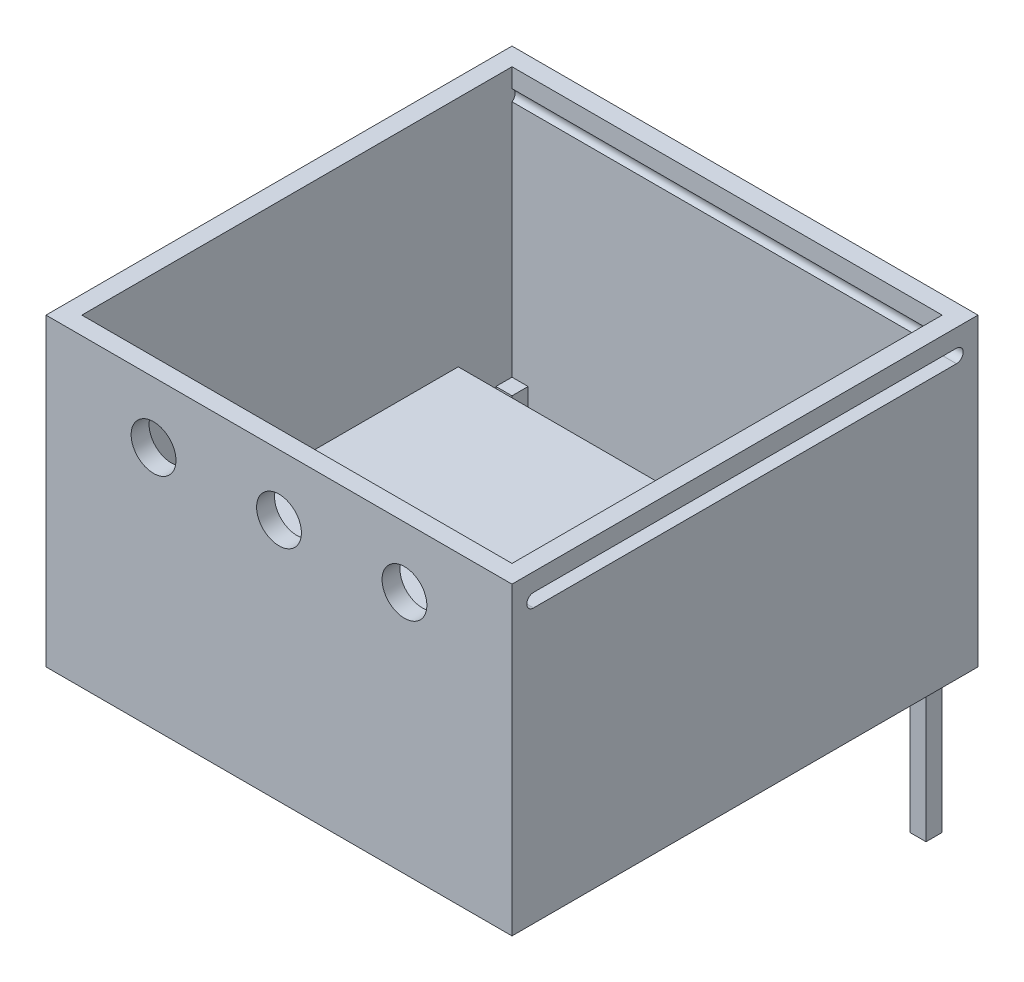
ISO-10303-21;
HEADER;
FILE_DESCRIPTION(('STEP AP214'),'2;1');
FILE_NAME('part.step','',(''),(''),'','','');
FILE_SCHEMA(('AUTOMOTIVE_DESIGN { 1 0 10303 214 1 1 1 1 }'));
ENDSEC;
DATA;
#1=APPLICATION_CONTEXT('core data for automotive mechanical design processes');
#2=APPLICATION_PROTOCOL_DEFINITION('international standard','automotive_design',2000,#1);
#3=PRODUCT_CONTEXT('',#1,'mechanical');
#4=PRODUCT('Part','Part','',(#3));
#5=PRODUCT_RELATED_PRODUCT_CATEGORY('part','',(#4));
#6=PRODUCT_DEFINITION_FORMATION('','',#4);
#7=PRODUCT_DEFINITION_CONTEXT('part definition',#1,'design');
#8=PRODUCT_DEFINITION('design','',#6,#7);
#9=PRODUCT_DEFINITION_SHAPE('','',#8);
#10=(LENGTH_UNIT() NAMED_UNIT(*) SI_UNIT(.MILLI.,.METRE.));
#11=(NAMED_UNIT(*) PLANE_ANGLE_UNIT() SI_UNIT($,.RADIAN.));
#12=(NAMED_UNIT(*) SI_UNIT($,.STERADIAN.) SOLID_ANGLE_UNIT());
#13=UNCERTAINTY_MEASURE_WITH_UNIT(LENGTH_MEASURE(1.E-05),#10,'distance_accuracy_value','');
#14=(GEOMETRIC_REPRESENTATION_CONTEXT(3) GLOBAL_UNCERTAINTY_ASSIGNED_CONTEXT((#13)) GLOBAL_UNIT_ASSIGNED_CONTEXT((#10,
#11,#12)) REPRESENTATION_CONTEXT('',''));
#15=CARTESIAN_POINT('',(0.,0.,0.));
#16=DIRECTION('',(0.,0.,1.));
#17=DIRECTION('',(1.,0.,0.));
#18=AXIS2_PLACEMENT_3D('',#15,#16,#17);
#19=CARTESIAN_POINT('',(24.,4.,-24.));
#20=DIRECTION('',(1.,0.,0.));
#21=DIRECTION('',(0.,0.,-1.));
#22=AXIS2_PLACEMENT_3D('',#19,#20,#21);
#23=PLANE('',#22);
#24=DIRECTION('',(0.,-1.,0.));
#25=VECTOR('',#24,1.);
#26=CARTESIAN_POINT('',(24.,4.,-22.2));
#27=LINE('',#26,#25);
#28=CARTESIAN_POINT('',(24.,4.,-22.2));
#29=VERTEX_POINT('',#28);
#30=CARTESIAN_POINT('',(24.,-16.,-22.2));
#31=VERTEX_POINT('',#30);
#32=EDGE_CURVE('E115',#29,#31,#27,.T.);
#33=ORIENTED_EDGE('',*,*,#32,.T.);
#34=DIRECTION('',(0.,0.,1.));
#35=VECTOR('',#34,1.);
#36=CARTESIAN_POINT('',(24.,-16.,-24.));
#37=LINE('',#36,#35);
#38=CARTESIAN_POINT('',(24.,-16.,-24.));
#39=VERTEX_POINT('',#38);
#40=EDGE_CURVE('E13',#39,#31,#37,.T.);
#41=ORIENTED_EDGE('',*,*,#40,.F.);
#42=DIRECTION('',(0.,-1.,0.));
#43=VECTOR('',#42,1.);
#44=CARTESIAN_POINT('',(24.,4.,-24.));
#45=LINE('',#44,#43);
#46=CARTESIAN_POINT('',(24.,4.,-24.));
#47=VERTEX_POINT('',#46);
#48=EDGE_CURVE('E139',#47,#39,#45,.T.);
#49=ORIENTED_EDGE('',*,*,#48,.F.);
#50=DIRECTION('',(0.,0.,1.));
#51=VECTOR('',#50,1.);
#52=CARTESIAN_POINT('',(24.,4.,-24.));
#53=LINE('',#52,#51);
#54=EDGE_CURVE('E141',#47,#29,#53,.T.);
#55=ORIENTED_EDGE('',*,*,#54,.T.);
#56=EDGE_LOOP('',(#33,#41,#49,#55));
#57=FACE_BOUND('',#56,.T.);
#58=ADVANCED_FACE('F100',(#57),#23,.T.);
#59=CARTESIAN_POINT('',(24.,4.,-24.));
#60=DIRECTION('',(0.,0.,-1.));
#61=DIRECTION('',(-1.,0.,0.));
#62=AXIS2_PLACEMENT_3D('',#59,#60,#61);
#63=PLANE('',#62);
#64=ORIENTED_EDGE('',*,*,#48,.T.);
#65=DIRECTION('',(1.,0.,0.));
#66=VECTOR('',#65,1.);
#67=CARTESIAN_POINT('',(24.,-16.,-24.));
#68=LINE('',#67,#66);
#69=CARTESIAN_POINT('',(22.2,-16.,-24.));
#70=VERTEX_POINT('',#69);
#71=EDGE_CURVE('E155',#70,#39,#68,.T.);
#72=ORIENTED_EDGE('',*,*,#71,.F.);
#73=DIRECTION('',(0.,-1.,0.));
#74=VECTOR('',#73,1.);
#75=CARTESIAN_POINT('',(22.2,4.,-24.));
#76=LINE('',#75,#74);
#77=CARTESIAN_POINT('',(22.2,4.,-24.));
#78=VERTEX_POINT('',#77);
#79=EDGE_CURVE('E146',#78,#70,#76,.T.);
#80=ORIENTED_EDGE('',*,*,#79,.F.);
#81=DIRECTION('',(1.,0.,0.));
#82=VECTOR('',#81,1.);
#83=CARTESIAN_POINT('',(24.,4.,-24.));
#84=LINE('',#83,#82);
#85=EDGE_CURVE('E153',#78,#47,#84,.T.);
#86=ORIENTED_EDGE('',*,*,#85,.T.);
#87=EDGE_LOOP('',(#64,#72,#80,#86));
#88=FACE_BOUND('',#87,.T.);
#89=ADVANCED_FACE('F157',(#88),#63,.T.);
#90=CARTESIAN_POINT('',(22.2,4.,-24.));
#91=DIRECTION('',(-1.,0.,0.));
#92=DIRECTION('',(0.,0.,1.));
#93=AXIS2_PLACEMENT_3D('',#90,#91,#92);
#94=PLANE('',#93);
#95=ORIENTED_EDGE('',*,*,#79,.T.);
#96=DIRECTION('',(0.,0.,-1.));
#97=VECTOR('',#96,1.);
#98=CARTESIAN_POINT('',(22.2,-16.,-24.));
#99=LINE('',#98,#97);
#100=CARTESIAN_POINT('',(22.2,-16.,-22.2));
#101=VERTEX_POINT('',#100);
#102=EDGE_CURVE('E167',#101,#70,#99,.T.);
#103=ORIENTED_EDGE('',*,*,#102,.F.);
#104=DIRECTION('',(0.,-1.,0.));
#105=VECTOR('',#104,1.);
#106=CARTESIAN_POINT('',(22.2,4.,-22.2));
#107=LINE('',#106,#105);
#108=CARTESIAN_POINT('',(22.2,4.,-22.2));
#109=VERTEX_POINT('',#108);
#110=EDGE_CURVE('E122',#109,#101,#107,.T.);
#111=ORIENTED_EDGE('',*,*,#110,.F.);
#112=DIRECTION('',(0.,0.,-1.));
#113=VECTOR('',#112,1.);
#114=CARTESIAN_POINT('',(22.2,4.,-24.));
#115=LINE('',#114,#113);
#116=EDGE_CURVE('E159',#109,#78,#115,.T.);
#117=ORIENTED_EDGE('',*,*,#116,.T.);
#118=EDGE_LOOP('',(#95,#103,#111,#117));
#119=FACE_BOUND('',#118,.T.);
#120=ADVANCED_FACE('F172',(#119),#94,.T.);
#121=CARTESIAN_POINT('',(24.,4.,-22.2));
#122=DIRECTION('',(0.,0.,1.));
#123=DIRECTION('',(1.,0.,0.));
#124=AXIS2_PLACEMENT_3D('',#121,#122,#123);
#125=PLANE('',#124);
#126=ORIENTED_EDGE('',*,*,#110,.T.);
#127=DIRECTION('',(-1.,0.,0.));
#128=VECTOR('',#127,1.);
#129=CARTESIAN_POINT('',(24.,-16.,-22.2));
#130=LINE('',#129,#128);
#131=EDGE_CURVE('E108',#31,#101,#130,.T.);
#132=ORIENTED_EDGE('',*,*,#131,.F.);
#133=ORIENTED_EDGE('',*,*,#32,.F.);
#134=DIRECTION('',(-1.,0.,0.));
#135=VECTOR('',#134,1.);
#136=CARTESIAN_POINT('',(24.,4.,-22.2));
#137=LINE('',#136,#135);
#138=EDGE_CURVE('E154',#29,#109,#137,.T.);
#139=ORIENTED_EDGE('',*,*,#138,.T.);
#140=EDGE_LOOP('',(#126,#132,#133,#139));
#141=FACE_BOUND('',#140,.T.);
#142=ADVANCED_FACE('F174',(#141),#125,.T.);
#143=CARTESIAN_POINT('',(0.,4.,0.));
#144=DIRECTION('',(0.,-1.,0.));
#145=DIRECTION('',(0.,0.,-1.));
#146=AXIS2_PLACEMENT_3D('',#143,#144,#145);
#147=PLANE('',#146);
#148=ORIENTED_EDGE('',*,*,#54,.F.);
#149=ORIENTED_EDGE('',*,*,#85,.F.);
#150=ORIENTED_EDGE('',*,*,#116,.F.);
#151=ORIENTED_EDGE('',*,*,#138,.F.);
#152=EDGE_LOOP('',(#148,#149,#150,#151));
#153=FACE_BOUND('',#152,.T.);
#154=ADVANCED_FACE('F151',(#153),#147,.F.);
#155=CARTESIAN_POINT('',(0.,-16.,0.));
#156=DIRECTION('',(0.,-1.,0.));
#157=DIRECTION('',(0.,0.,-1.));
#158=AXIS2_PLACEMENT_3D('',#155,#156,#157);
#159=PLANE('',#158);
#160=ORIENTED_EDGE('',*,*,#40,.T.);
#161=ORIENTED_EDGE('',*,*,#131,.T.);
#162=ORIENTED_EDGE('',*,*,#102,.T.);
#163=ORIENTED_EDGE('',*,*,#71,.T.);
#164=EDGE_LOOP('',(#160,#161,#162,#163));
#165=FACE_BOUND('',#164,.T.);
#166=ADVANCED_FACE('F102',(#165),#159,.T.);
#167=CLOSED_SHELL('',(#58,#89,#120,#142,#154,#166));
#168=MANIFOLD_SOLID_BREP('B2',#167);
#169=CARTESIAN_POINT('',(-24.,4.,-24.));
#170=DIRECTION('',(-1.,0.,0.));
#171=DIRECTION('',(0.,0.,1.));
#172=AXIS2_PLACEMENT_3D('',#169,#170,#171);
#173=PLANE('',#172);
#174=DIRECTION('',(0.,-1.,0.));
#175=VECTOR('',#174,1.);
#176=CARTESIAN_POINT('',(-24.,4.,-24.));
#177=LINE('',#176,#175);
#178=CARTESIAN_POINT('',(-24.,4.,-24.));
#179=VERTEX_POINT('',#178);
#180=CARTESIAN_POINT('',(-24.,-16.,-24.));
#181=VERTEX_POINT('',#180);
#182=EDGE_CURVE('E236',#179,#181,#177,.T.);
#183=ORIENTED_EDGE('',*,*,#182,.T.);
#184=DIRECTION('',(0.,0.,-1.));
#185=VECTOR('',#184,1.);
#186=CARTESIAN_POINT('',(-24.,-16.,-24.));
#187=LINE('',#186,#185);
#188=CARTESIAN_POINT('',(-24.,-16.,-22.2));
#189=VERTEX_POINT('',#188);
#190=EDGE_CURVE('E273',#189,#181,#187,.T.);
#191=ORIENTED_EDGE('',*,*,#190,.F.);
#192=DIRECTION('',(0.,-1.,0.));
#193=VECTOR('',#192,1.);
#194=CARTESIAN_POINT('',(-24.,4.,-22.2));
#195=LINE('',#194,#193);
#196=CARTESIAN_POINT('',(-24.,4.,-22.2));
#197=VERTEX_POINT('',#196);
#198=EDGE_CURVE('E98',#197,#189,#195,.T.);
#199=ORIENTED_EDGE('',*,*,#198,.F.);
#200=DIRECTION('',(0.,0.,-1.));
#201=VECTOR('',#200,1.);
#202=CARTESIAN_POINT('',(-24.,4.,-24.));
#203=LINE('',#202,#201);
#204=EDGE_CURVE('E274',#197,#179,#203,.T.);
#205=ORIENTED_EDGE('',*,*,#204,.T.);
#206=EDGE_LOOP('',(#183,#191,#199,#205));
#207=FACE_BOUND('',#206,.T.);
#208=ADVANCED_FACE('F233',(#207),#173,.T.);
#209=CARTESIAN_POINT('',(-24.,4.,-22.2));
#210=DIRECTION('',(0.,0.,1.));
#211=DIRECTION('',(1.,0.,0.));
#212=AXIS2_PLACEMENT_3D('',#209,#210,#211);
#213=PLANE('',#212);
#214=ORIENTED_EDGE('',*,*,#198,.T.);
#215=DIRECTION('',(-1.,0.,0.));
#216=VECTOR('',#215,1.);
#217=CARTESIAN_POINT('',(-24.,-16.,-22.2));
#218=LINE('',#217,#216);
#219=CARTESIAN_POINT('',(-22.2,-16.,-22.2));
#220=VERTEX_POINT('',#219);
#221=EDGE_CURVE('E290',#220,#189,#218,.T.);
#222=ORIENTED_EDGE('',*,*,#221,.F.);
#223=DIRECTION('',(0.,-1.,0.));
#224=VECTOR('',#223,1.);
#225=CARTESIAN_POINT('',(-22.2,4.,-22.2));
#226=LINE('',#225,#224);
#227=CARTESIAN_POINT('',(-22.2,4.,-22.2));
#228=VERTEX_POINT('',#227);
#229=EDGE_CURVE('E241',#228,#220,#226,.T.);
#230=ORIENTED_EDGE('',*,*,#229,.F.);
#231=DIRECTION('',(-1.,0.,0.));
#232=VECTOR('',#231,1.);
#233=CARTESIAN_POINT('',(-24.,4.,-22.2));
#234=LINE('',#233,#232);
#235=EDGE_CURVE('E279',#228,#197,#234,.T.);
#236=ORIENTED_EDGE('',*,*,#235,.T.);
#237=EDGE_LOOP('',(#214,#222,#230,#236));
#238=FACE_BOUND('',#237,.T.);
#239=ADVANCED_FACE('F305',(#238),#213,.T.);
#240=CARTESIAN_POINT('',(-22.2,4.,-24.));
#241=DIRECTION('',(1.,0.,0.));
#242=DIRECTION('',(0.,0.,-1.));
#243=AXIS2_PLACEMENT_3D('',#240,#241,#242);
#244=PLANE('',#243);
#245=ORIENTED_EDGE('',*,*,#229,.T.);
#246=DIRECTION('',(0.,0.,1.));
#247=VECTOR('',#246,1.);
#248=CARTESIAN_POINT('',(-22.2,-16.,-24.));
#249=LINE('',#248,#247);
#250=CARTESIAN_POINT('',(-22.2,-16.,-24.));
#251=VERTEX_POINT('',#250);
#252=EDGE_CURVE('E286',#251,#220,#249,.T.);
#253=ORIENTED_EDGE('',*,*,#252,.F.);
#254=DIRECTION('',(0.,-1.,0.));
#255=VECTOR('',#254,1.);
#256=CARTESIAN_POINT('',(-22.2,4.,-24.));
#257=LINE('',#256,#255);
#258=CARTESIAN_POINT('',(-22.2,4.,-24.));
#259=VERTEX_POINT('',#258);
#260=EDGE_CURVE('E278',#259,#251,#257,.T.);
#261=ORIENTED_EDGE('',*,*,#260,.F.);
#262=DIRECTION('',(0.,0.,1.));
#263=VECTOR('',#262,1.);
#264=CARTESIAN_POINT('',(-22.2,4.,-24.));
#265=LINE('',#264,#263);
#266=EDGE_CURVE('E298',#259,#228,#265,.T.);
#267=ORIENTED_EDGE('',*,*,#266,.T.);
#268=EDGE_LOOP('',(#245,#253,#261,#267));
#269=FACE_BOUND('',#268,.T.);
#270=ADVANCED_FACE('F302',(#269),#244,.T.);
#271=CARTESIAN_POINT('',(-24.,4.,-24.));
#272=DIRECTION('',(0.,0.,-1.));
#273=DIRECTION('',(-1.,0.,0.));
#274=AXIS2_PLACEMENT_3D('',#271,#272,#273);
#275=PLANE('',#274);
#276=ORIENTED_EDGE('',*,*,#260,.T.);
#277=DIRECTION('',(1.,0.,0.));
#278=VECTOR('',#277,1.);
#279=CARTESIAN_POINT('',(-24.,-16.,-24.));
#280=LINE('',#279,#278);
#281=EDGE_CURVE('E281',#181,#251,#280,.T.);
#282=ORIENTED_EDGE('',*,*,#281,.F.);
#283=ORIENTED_EDGE('',*,*,#182,.F.);
#284=DIRECTION('',(1.,0.,0.));
#285=VECTOR('',#284,1.);
#286=CARTESIAN_POINT('',(-24.,4.,-24.));
#287=LINE('',#286,#285);
#288=EDGE_CURVE('E296',#179,#259,#287,.T.);
#289=ORIENTED_EDGE('',*,*,#288,.T.);
#290=EDGE_LOOP('',(#276,#282,#283,#289));
#291=FACE_BOUND('',#290,.T.);
#292=ADVANCED_FACE('F282',(#291),#275,.T.);
#293=CARTESIAN_POINT('',(0.,4.,0.));
#294=DIRECTION('',(0.,1.,0.));
#295=DIRECTION('',(0.,0.,1.));
#296=AXIS2_PLACEMENT_3D('',#293,#294,#295);
#297=PLANE('',#296);
#298=ORIENTED_EDGE('',*,*,#204,.F.);
#299=ORIENTED_EDGE('',*,*,#235,.F.);
#300=ORIENTED_EDGE('',*,*,#266,.F.);
#301=ORIENTED_EDGE('',*,*,#288,.F.);
#302=EDGE_LOOP('',(#298,#299,#300,#301));
#303=FACE_BOUND('',#302,.T.);
#304=ADVANCED_FACE('F307',(#303),#297,.T.);
#305=CARTESIAN_POINT('',(0.,-16.,0.));
#306=DIRECTION('',(0.,1.,0.));
#307=DIRECTION('',(0.,0.,1.));
#308=AXIS2_PLACEMENT_3D('',#305,#306,#307);
#309=PLANE('',#308);
#310=ORIENTED_EDGE('',*,*,#190,.T.);
#311=ORIENTED_EDGE('',*,*,#281,.T.);
#312=ORIENTED_EDGE('',*,*,#252,.T.);
#313=ORIENTED_EDGE('',*,*,#221,.T.);
#314=EDGE_LOOP('',(#310,#311,#312,#313));
#315=FACE_BOUND('',#314,.T.);
#316=ADVANCED_FACE('F289',(#315),#309,.F.);
#317=CLOSED_SHELL('',(#208,#239,#270,#292,#304,#316));
#318=MANIFOLD_SOLID_BREP('B7',#317);
#319=CARTESIAN_POINT('',(-25.,-73.5391052434009,24.));
#320=DIRECTION('',(0.,0.,1.));
#321=DIRECTION('',(1.,0.,0.));
#322=AXIS2_PLACEMENT_3D('',#319,#320,#321);
#323=PLANE('',#322);
#324=CARTESIAN_POINT('',(-14.,27.2,24.));
#325=DIRECTION('',(0.,0.,1.));
#326=DIRECTION('',(1.,0.,0.));
#327=AXIS2_PLACEMENT_3D('',#324,#325,#326);
#328=CIRCLE('',#327,2.5);
#329=CARTESIAN_POINT('',(-11.5,27.2,24.));
#330=VERTEX_POINT('',#329);
#331=EDGE_CURVE('E654',#330,#330,#328,.F.);
#332=ORIENTED_EDGE('',*,*,#331,.F.);
#333=EDGE_LOOP('',(#332));
#334=FACE_BOUND('',#333,.T.);
#335=CARTESIAN_POINT('',(0.,27.2,24.));
#336=DIRECTION('',(0.,0.,1.));
#337=DIRECTION('',(1.,0.,0.));
#338=AXIS2_PLACEMENT_3D('',#335,#336,#337);
#339=CIRCLE('',#338,2.5);
#340=CARTESIAN_POINT('',(2.50000000000001,27.2,24.));
#341=VERTEX_POINT('',#340);
#342=EDGE_CURVE('E665',#341,#341,#339,.F.);
#343=ORIENTED_EDGE('',*,*,#342,.F.);
#344=EDGE_LOOP('',(#343));
#345=FACE_BOUND('',#344,.T.);
#346=CARTESIAN_POINT('',(14.,27.2,24.));
#347=DIRECTION('',(0.,0.,1.));
#348=DIRECTION('',(1.,0.,0.));
#349=AXIS2_PLACEMENT_3D('',#346,#347,#348);
#350=CIRCLE('',#349,2.5);
#351=CARTESIAN_POINT('',(16.5,27.2,24.));
#352=VERTEX_POINT('',#351);
#353=EDGE_CURVE('E659',#352,#352,#350,.F.);
#354=ORIENTED_EDGE('',*,*,#353,.F.);
#355=EDGE_LOOP('',(#354));
#356=FACE_BOUND('',#355,.T.);
#357=DIRECTION('',(0.,1.,0.));
#358=VECTOR('',#357,1.);
#359=CARTESIAN_POINT('',(-24.,-73.5391052434009,24.));
#360=LINE('',#359,#358);
#361=CARTESIAN_POINT('',(-24.,8.,24.));
#362=VERTEX_POINT('',#361);
#363=CARTESIAN_POINT('',(-24.,30.6155711229775,24.));
#364=VERTEX_POINT('',#363);
#365=EDGE_CURVE('E605',#362,#364,#360,.T.);
#366=ORIENTED_EDGE('',*,*,#365,.T.);
#367=DIRECTION('',(1.,0.,0.));
#368=VECTOR('',#367,1.);
#369=CARTESIAN_POINT('',(-72.7230951397795,30.6155711229775,24.));
#370=LINE('',#369,#368);
#371=CARTESIAN_POINT('',(24.,30.6155711229775,24.));
#372=VERTEX_POINT('',#371);
#373=EDGE_CURVE('E536',#364,#372,#370,.T.);
#374=ORIENTED_EDGE('',*,*,#373,.T.);
#375=DIRECTION('',(0.,1.,0.));
#376=VECTOR('',#375,1.);
#377=CARTESIAN_POINT('',(24.,-73.5391052434009,24.));
#378=LINE('',#377,#376);
#379=CARTESIAN_POINT('',(24.,7.99999999999998,24.));
#380=VERTEX_POINT('',#379);
#381=EDGE_CURVE('E601',#380,#372,#378,.T.);
#382=ORIENTED_EDGE('',*,*,#381,.F.);
#383=DIRECTION('',(1.,0.,0.));
#384=VECTOR('',#383,1.);
#385=CARTESIAN_POINT('',(0.,8.,24.));
#386=LINE('',#385,#384);
#387=EDGE_CURVE('E231',#362,#380,#386,.T.);
#388=ORIENTED_EDGE('',*,*,#387,.F.);
#389=EDGE_LOOP('',(#366,#374,#382,#388));
#390=FACE_BOUND('',#389,.T.);
#391=ADVANCED_FACE('F357',(#334,#345,#356,#390),#323,.F.);
#392=CARTESIAN_POINT('',(24.,-73.5391052434009,25.));
#393=DIRECTION('',(1.,0.,0.));
#394=DIRECTION('',(0.,0.,-1.));
#395=AXIS2_PLACEMENT_3D('',#392,#393,#394);
#396=PLANE('',#395);
#397=DIRECTION('',(0.,1.,0.));
#398=VECTOR('',#397,1.);
#399=CARTESIAN_POINT('',(24.,-73.5391052434009,-24.));
#400=LINE('',#399,#398);
#401=CARTESIAN_POINT('',(24.,31.8844288770225,-24.));
#402=VERTEX_POINT('',#401);
#403=CARTESIAN_POINT('',(24.,34.,-24.));
#404=VERTEX_POINT('',#403);
#405=EDGE_CURVE('E600',#402,#404,#400,.T.);
#406=ORIENTED_EDGE('',*,*,#405,.F.);
#407=CARTESIAN_POINT('',(24.,31.25,-23.6));
#408=DIRECTION('',(1.,0.,0.));
#409=DIRECTION('',(0.,0.,-1.));
#410=AXIS2_PLACEMENT_3D('',#407,#408,#409);
#411=CIRCLE('',#410,0.750000000000001);
#412=CARTESIAN_POINT('',(24.,32.,-23.6));
#413=VERTEX_POINT('',#412);
#414=EDGE_CURVE('E553',#402,#413,#411,.T.);
#415=ORIENTED_EDGE('',*,*,#414,.T.);
#416=DIRECTION('',(0.,0.,1.));
#417=VECTOR('',#416,1.);
#418=CARTESIAN_POINT('',(24.,32.,25.));
#419=LINE('',#418,#417);
#420=CARTESIAN_POINT('',(24.,32.,23.6));
#421=VERTEX_POINT('',#420);
#422=EDGE_CURVE('E543',#413,#421,#419,.T.);
#423=ORIENTED_EDGE('',*,*,#422,.T.);
#424=CARTESIAN_POINT('',(24.,31.25,23.6));
#425=DIRECTION('',(1.,0.,0.));
#426=DIRECTION('',(0.,0.,-1.));
#427=AXIS2_PLACEMENT_3D('',#424,#425,#426);
#428=CIRCLE('',#427,0.750000000000001);
#429=CARTESIAN_POINT('',(24.,31.8844288770225,24.));
#430=VERTEX_POINT('',#429);
#431=EDGE_CURVE('E537',#421,#430,#428,.T.);
#432=ORIENTED_EDGE('',*,*,#431,.T.);
#433=CARTESIAN_POINT('',(24.,34.,24.));
#434=VERTEX_POINT('',#433);
#435=EDGE_CURVE('E604',#430,#434,#378,.T.);
#436=ORIENTED_EDGE('',*,*,#435,.T.);
#437=DIRECTION('',(0.,0.,-1.));
#438=VECTOR('',#437,1.);
#439=CARTESIAN_POINT('',(24.,34.,25.));
#440=LINE('',#439,#438);
#441=EDGE_CURVE('E565',#434,#404,#440,.T.);
#442=ORIENTED_EDGE('',*,*,#441,.T.);
#443=EDGE_LOOP('',(#406,#415,#423,#432,#436,#442));
#444=FACE_BOUND('',#443,.T.);
#445=ADVANCED_FACE('F635',(#444),#396,.F.);
#446=CARTESIAN_POINT('',(25.,-73.5391052434009,-24.));
#447=DIRECTION('',(0.,0.,-1.));
#448=DIRECTION('',(-1.,0.,0.));
#449=AXIS2_PLACEMENT_3D('',#446,#447,#448);
#450=PLANE('',#449);
#451=DIRECTION('',(0.,1.,0.));
#452=VECTOR('',#451,1.);
#453=CARTESIAN_POINT('',(-24.,-73.5391052434009,-24.));
#454=LINE('',#453,#452);
#455=CARTESIAN_POINT('',(-24.,31.8844288770225,-24.));
#456=VERTEX_POINT('',#455);
#457=CARTESIAN_POINT('',(-24.,34.,-24.));
#458=VERTEX_POINT('',#457);
#459=EDGE_CURVE('E596',#456,#458,#454,.T.);
#460=ORIENTED_EDGE('',*,*,#459,.F.);
#461=DIRECTION('',(1.,0.,0.));
#462=VECTOR('',#461,1.);
#463=CARTESIAN_POINT('',(-72.7230951397795,31.8844288770225,-24.));
#464=LINE('',#463,#462);
#465=EDGE_CURVE('E552',#456,#402,#464,.T.);
#466=ORIENTED_EDGE('',*,*,#465,.T.);
#467=ORIENTED_EDGE('',*,*,#405,.T.);
#468=DIRECTION('',(-1.,0.,0.));
#469=VECTOR('',#468,1.);
#470=CARTESIAN_POINT('',(25.,34.,-24.));
#471=LINE('',#470,#469);
#472=EDGE_CURVE('E568',#404,#458,#471,.T.);
#473=ORIENTED_EDGE('',*,*,#472,.T.);
#474=EDGE_LOOP('',(#460,#466,#467,#473));
#475=FACE_BOUND('',#474,.T.);
#476=ADVANCED_FACE('F719',(#475),#450,.F.);
#477=CARTESIAN_POINT('',(0.,0.,0.));
#478=DIRECTION('',(0.,1.,0.));
#479=DIRECTION('',(0.,0.,1.));
#480=AXIS2_PLACEMENT_3D('',#477,#478,#479);
#481=PLANE('',#480);
#482=DIRECTION('',(1.,0.,0.));
#483=VECTOR('',#482,1.);
#484=CARTESIAN_POINT('',(-24.,0.,-24.));
#485=LINE('',#484,#483);
#486=CARTESIAN_POINT('',(-24.,0.,-24.));
#487=VERTEX_POINT('',#486);
#488=CARTESIAN_POINT('',(24.,0.,-24.));
#489=VERTEX_POINT('',#488);
#490=EDGE_CURVE('E501',#487,#489,#485,.T.);
#491=ORIENTED_EDGE('',*,*,#490,.F.);
#492=DIRECTION('',(0.,0.,-1.));
#493=VECTOR('',#492,1.);
#494=CARTESIAN_POINT('',(-24.,0.,-24.));
#495=LINE('',#494,#493);
#496=CARTESIAN_POINT('',(-24.,0.,-18.));
#497=VERTEX_POINT('',#496);
#498=EDGE_CURVE('E486',#497,#487,#495,.T.);
#499=ORIENTED_EDGE('',*,*,#498,.F.);
#500=DIRECTION('',(-1.,0.,0.));
#501=VECTOR('',#500,1.);
#502=CARTESIAN_POINT('',(-24.,0.,-18.));
#503=LINE('',#502,#501);
#504=CARTESIAN_POINT('',(24.,0.,-18.));
#505=VERTEX_POINT('',#504);
#506=EDGE_CURVE('E494',#505,#497,#503,.T.);
#507=ORIENTED_EDGE('',*,*,#506,.F.);
#508=DIRECTION('',(0.,0.,1.));
#509=VECTOR('',#508,1.);
#510=CARTESIAN_POINT('',(24.,0.,-24.));
#511=LINE('',#510,#509);
#512=EDGE_CURVE('E380',#489,#505,#511,.T.);
#513=ORIENTED_EDGE('',*,*,#512,.F.);
#514=EDGE_LOOP('',(#491,#499,#507,#513));
#515=FACE_BOUND('',#514,.T.);
#516=DIRECTION('',(0.,0.,-1.));
#517=VECTOR('',#516,1.);
#518=CARTESIAN_POINT('',(-26.,0.,-25.));
#519=LINE('',#518,#517);
#520=CARTESIAN_POINT('',(-26.,0.,26.));
#521=VERTEX_POINT('',#520);
#522=CARTESIAN_POINT('',(-26.,0.,-26.));
#523=VERTEX_POINT('',#522);
#524=EDGE_CURVE('E586',#521,#523,#519,.T.);
#525=ORIENTED_EDGE('',*,*,#524,.T.);
#526=DIRECTION('',(1.,0.,0.));
#527=VECTOR('',#526,1.);
#528=CARTESIAN_POINT('',(25.,0.,-26.));
#529=LINE('',#528,#527);
#530=CARTESIAN_POINT('',(26.,0.,-26.));
#531=VERTEX_POINT('',#530);
#532=EDGE_CURVE('E589',#523,#531,#529,.T.);
#533=ORIENTED_EDGE('',*,*,#532,.T.);
#534=DIRECTION('',(0.,0.,1.));
#535=VECTOR('',#534,1.);
#536=CARTESIAN_POINT('',(26.,0.,25.));
#537=LINE('',#536,#535);
#538=CARTESIAN_POINT('',(26.,0.,26.));
#539=VERTEX_POINT('',#538);
#540=EDGE_CURVE('E587',#531,#539,#537,.T.);
#541=ORIENTED_EDGE('',*,*,#540,.T.);
#542=DIRECTION('',(-1.,0.,0.));
#543=VECTOR('',#542,1.);
#544=CARTESIAN_POINT('',(-25.,0.,26.));
#545=LINE('',#544,#543);
#546=EDGE_CURVE('E584',#539,#521,#545,.T.);
#547=ORIENTED_EDGE('',*,*,#546,.T.);
#548=EDGE_LOOP('',(#525,#533,#541,#547));
#549=FACE_BOUND('',#548,.T.);
#550=ADVANCED_FACE('F359',(#515,#549),#481,.F.);
#551=CARTESIAN_POINT('',(-25.,-73.5391052434009,26.));
#552=DIRECTION('',(0.,0.,1.));
#553=DIRECTION('',(1.,0.,0.));
#554=AXIS2_PLACEMENT_3D('',#551,#552,#553);
#555=PLANE('',#554);
#556=CARTESIAN_POINT('',(-14.,27.2,26.));
#557=DIRECTION('',(0.,0.,1.));
#558=DIRECTION('',(1.,0.,0.));
#559=AXIS2_PLACEMENT_3D('',#556,#557,#558);
#560=CIRCLE('',#559,2.5);
#561=CARTESIAN_POINT('',(-11.5,27.2,26.));
#562=VERTEX_POINT('',#561);
#563=EDGE_CURVE('E656',#562,#562,#560,.T.);
#564=ORIENTED_EDGE('',*,*,#563,.F.);
#565=EDGE_LOOP('',(#564));
#566=FACE_BOUND('',#565,.T.);
#567=CARTESIAN_POINT('',(0.,27.2,26.));
#568=DIRECTION('',(0.,0.,1.));
#569=DIRECTION('',(1.,0.,0.));
#570=AXIS2_PLACEMENT_3D('',#567,#568,#569);
#571=CIRCLE('',#570,2.5);
#572=CARTESIAN_POINT('',(2.50000000000001,27.2,26.));
#573=VERTEX_POINT('',#572);
#574=EDGE_CURVE('E668',#573,#573,#571,.T.);
#575=ORIENTED_EDGE('',*,*,#574,.F.);
#576=EDGE_LOOP('',(#575));
#577=FACE_BOUND('',#576,.T.);
#578=CARTESIAN_POINT('',(14.,27.2,26.));
#579=DIRECTION('',(0.,0.,1.));
#580=DIRECTION('',(1.,0.,0.));
#581=AXIS2_PLACEMENT_3D('',#578,#579,#580);
#582=CIRCLE('',#581,2.5);
#583=CARTESIAN_POINT('',(16.5,27.2,26.));
#584=VERTEX_POINT('',#583);
#585=EDGE_CURVE('E662',#584,#584,#582,.T.);
#586=ORIENTED_EDGE('',*,*,#585,.F.);
#587=EDGE_LOOP('',(#586));
#588=FACE_BOUND('',#587,.T.);
#589=ORIENTED_EDGE('',*,*,#546,.F.);
#590=DIRECTION('',(0.,1.,0.));
#591=VECTOR('',#590,1.);
#592=CARTESIAN_POINT('',(26.,-73.5391052434009,26.));
#593=LINE('',#592,#591);
#594=CARTESIAN_POINT('',(26.,34.,26.));
#595=VERTEX_POINT('',#594);
#596=EDGE_CURVE('E611',#539,#595,#593,.T.);
#597=ORIENTED_EDGE('',*,*,#596,.T.);
#598=DIRECTION('',(1.,0.,0.));
#599=VECTOR('',#598,1.);
#600=CARTESIAN_POINT('',(-25.,34.,26.));
#601=LINE('',#600,#599);
#602=CARTESIAN_POINT('',(-26.,34.,26.));
#603=VERTEX_POINT('',#602);
#604=EDGE_CURVE('E574',#603,#595,#601,.T.);
#605=ORIENTED_EDGE('',*,*,#604,.F.);
#606=DIRECTION('',(0.,1.,0.));
#607=VECTOR('',#606,1.);
#608=CARTESIAN_POINT('',(-26.,-73.5391052434009,26.));
#609=LINE('',#608,#607);
#610=EDGE_CURVE('E595',#521,#603,#609,.T.);
#611=ORIENTED_EDGE('',*,*,#610,.F.);
#612=EDGE_LOOP('',(#589,#597,#605,#611));
#613=FACE_BOUND('',#612,.T.);
#614=ADVANCED_FACE('F677',(#566,#577,#588,#613),#555,.T.);
#615=CARTESIAN_POINT('',(26.,-73.5391052434009,25.));
#616=DIRECTION('',(1.,0.,0.));
#617=DIRECTION('',(0.,0.,-1.));
#618=AXIS2_PLACEMENT_3D('',#615,#616,#617);
#619=PLANE('',#618);
#620=DIRECTION('',(0.,0.,-1.));
#621=VECTOR('',#620,1.);
#622=CARTESIAN_POINT('',(26.,30.5,23.6));
#623=LINE('',#622,#621);
#624=CARTESIAN_POINT('',(26.,30.5,23.6));
#625=VERTEX_POINT('',#624);
#626=CARTESIAN_POINT('',(26.,30.5,-23.6));
#627=VERTEX_POINT('',#626);
#628=EDGE_CURVE('E514',#625,#627,#623,.T.);
#629=ORIENTED_EDGE('',*,*,#628,.F.);
#630=CARTESIAN_POINT('',(26.,31.25,23.6));
#631=DIRECTION('',(1.,0.,0.));
#632=DIRECTION('',(0.,0.,-1.));
#633=AXIS2_PLACEMENT_3D('',#630,#631,#632);
#634=CIRCLE('',#633,0.750000000000001);
#635=CARTESIAN_POINT('',(26.,32.,23.6));
#636=VERTEX_POINT('',#635);
#637=EDGE_CURVE('E497',#636,#625,#634,.T.);
#638=ORIENTED_EDGE('',*,*,#637,.F.);
#639=DIRECTION('',(0.,0.,1.));
#640=VECTOR('',#639,1.);
#641=CARTESIAN_POINT('',(26.,32.,23.6));
#642=LINE('',#641,#640);
#643=CARTESIAN_POINT('',(26.,32.,-23.6));
#644=VERTEX_POINT('',#643);
#645=EDGE_CURVE('E508',#644,#636,#642,.T.);
#646=ORIENTED_EDGE('',*,*,#645,.F.);
#647=CARTESIAN_POINT('',(26.,31.25,-23.6));
#648=DIRECTION('',(1.,0.,0.));
#649=DIRECTION('',(0.,0.,-1.));
#650=AXIS2_PLACEMENT_3D('',#647,#648,#649);
#651=CIRCLE('',#650,0.750000000000001);
#652=EDGE_CURVE('E511',#627,#644,#651,.T.);
#653=ORIENTED_EDGE('',*,*,#652,.F.);
#654=EDGE_LOOP('',(#629,#638,#646,#653));
#655=FACE_BOUND('',#654,.T.);
#656=ORIENTED_EDGE('',*,*,#540,.F.);
#657=DIRECTION('',(0.,1.,0.));
#658=VECTOR('',#657,1.);
#659=CARTESIAN_POINT('',(26.,-73.5391052434009,-26.));
#660=LINE('',#659,#658);
#661=CARTESIAN_POINT('',(26.,34.,-26.));
#662=VERTEX_POINT('',#661);
#663=EDGE_CURVE('E609',#531,#662,#660,.T.);
#664=ORIENTED_EDGE('',*,*,#663,.T.);
#665=DIRECTION('',(0.,0.,-1.));
#666=VECTOR('',#665,1.);
#667=CARTESIAN_POINT('',(26.,34.,25.));
#668=LINE('',#667,#666);
#669=EDGE_CURVE('E577',#595,#662,#668,.T.);
#670=ORIENTED_EDGE('',*,*,#669,.F.);
#671=ORIENTED_EDGE('',*,*,#596,.F.);
#672=EDGE_LOOP('',(#656,#664,#670,#671));
#673=FACE_BOUND('',#672,.T.);
#674=ADVANCED_FACE('F648',(#655,#673),#619,.T.);
#675=CARTESIAN_POINT('',(25.,-73.5391052434009,-26.));
#676=DIRECTION('',(0.,0.,-1.));
#677=DIRECTION('',(-1.,0.,0.));
#678=AXIS2_PLACEMENT_3D('',#675,#676,#677);
#679=PLANE('',#678);
#680=ORIENTED_EDGE('',*,*,#532,.F.);
#681=DIRECTION('',(0.,1.,0.));
#682=VECTOR('',#681,1.);
#683=CARTESIAN_POINT('',(-26.,-73.5391052434009,-26.));
#684=LINE('',#683,#682);
#685=CARTESIAN_POINT('',(-26.,34.,-26.));
#686=VERTEX_POINT('',#685);
#687=EDGE_CURVE('E590',#523,#686,#684,.T.);
#688=ORIENTED_EDGE('',*,*,#687,.T.);
#689=DIRECTION('',(-1.,0.,0.));
#690=VECTOR('',#689,1.);
#691=CARTESIAN_POINT('',(25.,34.,-26.));
#692=LINE('',#691,#690);
#693=EDGE_CURVE('E580',#662,#686,#692,.T.);
#694=ORIENTED_EDGE('',*,*,#693,.F.);
#695=ORIENTED_EDGE('',*,*,#663,.F.);
#696=EDGE_LOOP('',(#680,#688,#694,#695));
#697=FACE_BOUND('',#696,.T.);
#698=ADVANCED_FACE('F698',(#697),#679,.T.);
#699=CARTESIAN_POINT('',(-26.,-73.5391052434009,-25.));
#700=DIRECTION('',(-1.,0.,0.));
#701=DIRECTION('',(0.,0.,1.));
#702=AXIS2_PLACEMENT_3D('',#699,#700,#701);
#703=PLANE('',#702);
#704=ORIENTED_EDGE('',*,*,#524,.F.);
#705=ORIENTED_EDGE('',*,*,#610,.T.);
#706=DIRECTION('',(0.,0.,1.));
#707=VECTOR('',#706,1.);
#708=CARTESIAN_POINT('',(-26.,34.,-25.));
#709=LINE('',#708,#707);
#710=EDGE_CURVE('E571',#686,#603,#709,.T.);
#711=ORIENTED_EDGE('',*,*,#710,.F.);
#712=ORIENTED_EDGE('',*,*,#687,.F.);
#713=EDGE_LOOP('',(#704,#705,#711,#712));
#714=FACE_BOUND('',#713,.T.);
#715=ADVANCED_FACE('F694',(#714),#703,.T.);
#716=ORIENTED_EDGE('',*,*,#435,.F.);
#717=DIRECTION('',(1.,0.,0.));
#718=VECTOR('',#717,1.);
#719=CARTESIAN_POINT('',(-72.7230951397795,31.8844288770225,24.));
#720=LINE('',#719,#718);
#721=CARTESIAN_POINT('',(-24.,31.8844288770225,24.));
#722=VERTEX_POINT('',#721);
#723=EDGE_CURVE('E540',#430,#722,#720,.F.);
#724=ORIENTED_EDGE('',*,*,#723,.T.);
#725=CARTESIAN_POINT('',(-24.,34.,24.));
#726=VERTEX_POINT('',#725);
#727=EDGE_CURVE('E583',#722,#726,#360,.T.);
#728=ORIENTED_EDGE('',*,*,#727,.T.);
#729=DIRECTION('',(1.,0.,0.));
#730=VECTOR('',#729,1.);
#731=CARTESIAN_POINT('',(-25.,34.,24.));
#732=LINE('',#731,#730);
#733=EDGE_CURVE('E562',#726,#434,#732,.T.);
#734=ORIENTED_EDGE('',*,*,#733,.T.);
#735=EDGE_LOOP('',(#716,#724,#728,#734));
#736=FACE_BOUND('',#735,.T.);
#737=ADVANCED_FACE('F629',(#736),#323,.F.);
#738=DIRECTION('',(0.,0.,-1.));
#739=VECTOR('',#738,1.);
#740=CARTESIAN_POINT('',(24.,30.5,25.));
#741=LINE('',#740,#739);
#742=CARTESIAN_POINT('',(24.,30.5,23.6));
#743=VERTEX_POINT('',#742);
#744=CARTESIAN_POINT('',(24.,30.5,-23.6));
#745=VERTEX_POINT('',#744);
#746=EDGE_CURVE('E556',#743,#745,#741,.T.);
#747=ORIENTED_EDGE('',*,*,#746,.T.);
#748=CARTESIAN_POINT('',(24.,30.6155711229775,-24.));
#749=VERTEX_POINT('',#748);
#750=EDGE_CURVE('E549',#745,#749,#411,.T.);
#751=ORIENTED_EDGE('',*,*,#750,.T.);
#752=EDGE_CURVE('E597',#489,#749,#400,.T.);
#753=ORIENTED_EDGE('',*,*,#752,.F.);
#754=ORIENTED_EDGE('',*,*,#512,.T.);
#755=DIRECTION('',(0.,1.,0.));
#756=VECTOR('',#755,1.);
#757=CARTESIAN_POINT('',(24.,-0.00100000000002702,-18.));
#758=LINE('',#757,#756);
#759=CARTESIAN_POINT('',(24.,8.,-18.));
#760=VERTEX_POINT('',#759);
#761=EDGE_CURVE('E490',#505,#760,#758,.T.);
#762=ORIENTED_EDGE('',*,*,#761,.T.);
#763=DIRECTION('',(0.,0.,-1.));
#764=VECTOR('',#763,1.);
#765=CARTESIAN_POINT('',(24.,8.,0.));
#766=LINE('',#765,#764);
#767=EDGE_CURVE('E365',#380,#760,#766,.T.);
#768=ORIENTED_EDGE('',*,*,#767,.F.);
#769=ORIENTED_EDGE('',*,*,#381,.T.);
#770=EDGE_CURVE('E533',#372,#743,#428,.T.);
#771=ORIENTED_EDGE('',*,*,#770,.T.);
#772=EDGE_LOOP('',(#747,#751,#753,#754,#762,#768,#769,#771));
#773=FACE_BOUND('',#772,.T.);
#774=ADVANCED_FACE('F619',(#773),#396,.F.);
#775=ORIENTED_EDGE('',*,*,#752,.T.);
#776=DIRECTION('',(1.,0.,0.));
#777=VECTOR('',#776,1.);
#778=CARTESIAN_POINT('',(-72.7230951397795,30.6155711229775,-24.));
#779=LINE('',#778,#777);
#780=CARTESIAN_POINT('',(-24.,30.6155711229775,-24.));
#781=VERTEX_POINT('',#780);
#782=EDGE_CURVE('E546',#749,#781,#779,.F.);
#783=ORIENTED_EDGE('',*,*,#782,.T.);
#784=EDGE_CURVE('E593',#487,#781,#454,.T.);
#785=ORIENTED_EDGE('',*,*,#784,.F.);
#786=ORIENTED_EDGE('',*,*,#490,.T.);
#787=EDGE_LOOP('',(#775,#783,#785,#786));
#788=FACE_BOUND('',#787,.T.);
#789=ADVANCED_FACE('F653',(#788),#450,.F.);
#790=CARTESIAN_POINT('',(-24.,-73.5391052434009,-25.));
#791=DIRECTION('',(-1.,0.,0.));
#792=DIRECTION('',(0.,0.,1.));
#793=AXIS2_PLACEMENT_3D('',#790,#791,#792);
#794=PLANE('',#793);
#795=ORIENTED_EDGE('',*,*,#784,.T.);
#796=CARTESIAN_POINT('',(-24.,31.25,-23.6));
#797=DIRECTION('',(-1.,0.,0.));
#798=DIRECTION('',(0.,0.,1.));
#799=AXIS2_PLACEMENT_3D('',#796,#797,#798);
#800=CIRCLE('',#799,0.750000000000001);
#801=EDGE_CURVE('E524',#781,#456,#800,.F.);
#802=ORIENTED_EDGE('',*,*,#801,.T.);
#803=ORIENTED_EDGE('',*,*,#459,.T.);
#804=DIRECTION('',(0.,0.,1.));
#805=VECTOR('',#804,1.);
#806=CARTESIAN_POINT('',(-24.,34.,-25.));
#807=LINE('',#806,#805);
#808=EDGE_CURVE('E559',#458,#726,#807,.T.);
#809=ORIENTED_EDGE('',*,*,#808,.T.);
#810=ORIENTED_EDGE('',*,*,#727,.F.);
#811=CARTESIAN_POINT('',(-24.,31.25,23.6));
#812=DIRECTION('',(-1.,0.,0.));
#813=DIRECTION('',(0.,0.,1.));
#814=AXIS2_PLACEMENT_3D('',#811,#812,#813);
#815=CIRCLE('',#814,0.750000000000001);
#816=EDGE_CURVE('E519',#722,#364,#815,.F.);
#817=ORIENTED_EDGE('',*,*,#816,.T.);
#818=ORIENTED_EDGE('',*,*,#365,.F.);
#819=DIRECTION('',(0.,0.,1.));
#820=VECTOR('',#819,1.);
#821=CARTESIAN_POINT('',(-24.,8.,0.));
#822=LINE('',#821,#820);
#823=CARTESIAN_POINT('',(-24.,8.,-18.));
#824=VERTEX_POINT('',#823);
#825=EDGE_CURVE('E489',#824,#362,#822,.T.);
#826=ORIENTED_EDGE('',*,*,#825,.F.);
#827=DIRECTION('',(0.,1.,0.));
#828=VECTOR('',#827,1.);
#829=CARTESIAN_POINT('',(-24.,-0.00100000000002702,-18.));
#830=LINE('',#829,#828);
#831=EDGE_CURVE('E372',#497,#824,#830,.T.);
#832=ORIENTED_EDGE('',*,*,#831,.F.);
#833=ORIENTED_EDGE('',*,*,#498,.T.);
#834=EDGE_LOOP('',(#795,#802,#803,#809,#810,#817,#818,#826,#832,#833));
#835=FACE_BOUND('',#834,.T.);
#836=ADVANCED_FACE('F484',(#835),#794,.F.);
#837=CARTESIAN_POINT('',(0.,34.,0.));
#838=DIRECTION('',(0.,1.,0.));
#839=DIRECTION('',(0.,0.,1.));
#840=AXIS2_PLACEMENT_3D('',#837,#838,#839);
#841=PLANE('',#840);
#842=ORIENTED_EDGE('',*,*,#710,.T.);
#843=ORIENTED_EDGE('',*,*,#604,.T.);
#844=ORIENTED_EDGE('',*,*,#669,.T.);
#845=ORIENTED_EDGE('',*,*,#693,.T.);
#846=EDGE_LOOP('',(#842,#843,#844,#845));
#847=FACE_BOUND('',#846,.T.);
#848=ORIENTED_EDGE('',*,*,#733,.F.);
#849=ORIENTED_EDGE('',*,*,#808,.F.);
#850=ORIENTED_EDGE('',*,*,#472,.F.);
#851=ORIENTED_EDGE('',*,*,#441,.F.);
#852=EDGE_LOOP('',(#848,#849,#850,#851));
#853=FACE_BOUND('',#852,.T.);
#854=ADVANCED_FACE('F701',(#847,#853),#841,.T.);
#855=CARTESIAN_POINT('',(0.,8.,0.));
#856=DIRECTION('',(0.,1.,0.));
#857=DIRECTION('',(0.,0.,1.));
#858=AXIS2_PLACEMENT_3D('',#855,#856,#857);
#859=PLANE('',#858);
#860=DIRECTION('',(1.,0.,0.));
#861=VECTOR('',#860,1.);
#862=CARTESIAN_POINT('',(-24.,8.,-18.));
#863=LINE('',#862,#861);
#864=EDGE_CURVE('E491',#824,#760,#863,.T.);
#865=ORIENTED_EDGE('',*,*,#864,.F.);
#866=ORIENTED_EDGE('',*,*,#825,.T.);
#867=ORIENTED_EDGE('',*,*,#387,.T.);
#868=ORIENTED_EDGE('',*,*,#767,.T.);
#869=EDGE_LOOP('',(#865,#866,#867,#868));
#870=FACE_BOUND('',#869,.T.);
#871=ADVANCED_FACE('F616',(#870),#859,.T.);
#872=CARTESIAN_POINT('',(-72.7230951397795,30.5,23.6));
#873=DIRECTION('',(0.,-1.,0.));
#874=DIRECTION('',(0.,0.,-1.));
#875=AXIS2_PLACEMENT_3D('',#872,#873,#874);
#876=PLANE('',#875);
#877=DIRECTION('',(1.,0.,0.));
#878=VECTOR('',#877,1.);
#879=CARTESIAN_POINT('',(-72.7230951397795,30.5,23.6));
#880=LINE('',#879,#878);
#881=EDGE_CURVE('E522',#743,#625,#880,.T.);
#882=ORIENTED_EDGE('',*,*,#881,.T.);
#883=ORIENTED_EDGE('',*,*,#628,.T.);
#884=DIRECTION('',(1.,0.,0.));
#885=VECTOR('',#884,1.);
#886=CARTESIAN_POINT('',(-72.7230951397795,30.5,-23.6));
#887=LINE('',#886,#885);
#888=EDGE_CURVE('E510',#745,#627,#887,.T.);
#889=ORIENTED_EDGE('',*,*,#888,.F.);
#890=ORIENTED_EDGE('',*,*,#746,.F.);
#891=EDGE_LOOP('',(#882,#883,#889,#890));
#892=FACE_BOUND('',#891,.T.);
#893=ADVANCED_FACE('F651',(#892),#876,.F.);
#894=CARTESIAN_POINT('',(-72.7230951397795,31.25,-23.6));
#895=DIRECTION('',(1.,0.,0.));
#896=DIRECTION('',(0.,0.,-1.));
#897=AXIS2_PLACEMENT_3D('',#894,#895,#896);
#898=CYLINDRICAL_SURFACE('',#897,0.750000000000001);
#899=ORIENTED_EDGE('',*,*,#465,.F.);
#900=ORIENTED_EDGE('',*,*,#801,.F.);
#901=ORIENTED_EDGE('',*,*,#782,.F.);
#902=ORIENTED_EDGE('',*,*,#750,.F.);
#903=ORIENTED_EDGE('',*,*,#888,.T.);
#904=ORIENTED_EDGE('',*,*,#652,.T.);
#905=DIRECTION('',(1.,0.,0.));
#906=VECTOR('',#905,1.);
#907=CARTESIAN_POINT('',(-72.7230951397795,32.,-23.6));
#908=LINE('',#907,#906);
#909=EDGE_CURVE('E527',#413,#644,#908,.T.);
#910=ORIENTED_EDGE('',*,*,#909,.F.);
#911=ORIENTED_EDGE('',*,*,#414,.F.);
#912=EDGE_LOOP('',(#899,#900,#901,#902,#903,#904,#910,#911));
#913=FACE_BOUND('',#912,.T.);
#914=ADVANCED_FACE('F641',(#913),#898,.F.);
#915=CARTESIAN_POINT('',(-72.7230951397795,32.,23.6));
#916=DIRECTION('',(0.,1.,0.));
#917=DIRECTION('',(0.,0.,1.));
#918=AXIS2_PLACEMENT_3D('',#915,#916,#917);
#919=PLANE('',#918);
#920=ORIENTED_EDGE('',*,*,#909,.T.);
#921=ORIENTED_EDGE('',*,*,#645,.T.);
#922=DIRECTION('',(1.,0.,0.));
#923=VECTOR('',#922,1.);
#924=CARTESIAN_POINT('',(-72.7230951397795,32.,23.6));
#925=LINE('',#924,#923);
#926=EDGE_CURVE('E523',#421,#636,#925,.T.);
#927=ORIENTED_EDGE('',*,*,#926,.F.);
#928=ORIENTED_EDGE('',*,*,#422,.F.);
#929=EDGE_LOOP('',(#920,#921,#927,#928));
#930=FACE_BOUND('',#929,.T.);
#931=ADVANCED_FACE('F639',(#930),#919,.F.);
#932=CARTESIAN_POINT('',(-72.7230951397795,31.25,23.6));
#933=DIRECTION('',(1.,0.,0.));
#934=DIRECTION('',(0.,0.,-1.));
#935=AXIS2_PLACEMENT_3D('',#932,#933,#934);
#936=CYLINDRICAL_SURFACE('',#935,0.750000000000001);
#937=ORIENTED_EDGE('',*,*,#431,.F.);
#938=ORIENTED_EDGE('',*,*,#926,.T.);
#939=ORIENTED_EDGE('',*,*,#637,.T.);
#940=ORIENTED_EDGE('',*,*,#881,.F.);
#941=ORIENTED_EDGE('',*,*,#770,.F.);
#942=ORIENTED_EDGE('',*,*,#373,.F.);
#943=ORIENTED_EDGE('',*,*,#816,.F.);
#944=ORIENTED_EDGE('',*,*,#723,.F.);
#945=EDGE_LOOP('',(#937,#938,#939,#940,#941,#942,#943,#944));
#946=FACE_BOUND('',#945,.T.);
#947=ADVANCED_FACE('F622',(#946),#936,.F.);
#948=CARTESIAN_POINT('',(-24.,-0.00100000000002702,-18.));
#949=DIRECTION('',(0.,0.,1.));
#950=DIRECTION('',(1.,0.,0.));
#951=AXIS2_PLACEMENT_3D('',#948,#949,#950);
#952=PLANE('',#951);
#953=ORIENTED_EDGE('',*,*,#506,.T.);
#954=ORIENTED_EDGE('',*,*,#831,.T.);
#955=ORIENTED_EDGE('',*,*,#864,.T.);
#956=ORIENTED_EDGE('',*,*,#761,.F.);
#957=EDGE_LOOP('',(#953,#954,#955,#956));
#958=FACE_BOUND('',#957,.T.);
#959=ADVANCED_FACE('F495',(#958),#952,.F.);
#960=CARTESIAN_POINT('',(14.,27.2,-26.001));
#961=DIRECTION('',(0.,0.,1.));
#962=DIRECTION('',(1.,0.,0.));
#963=AXIS2_PLACEMENT_3D('',#960,#961,#962);
#964=CYLINDRICAL_SURFACE('',#963,2.5);
#965=ORIENTED_EDGE('',*,*,#585,.T.);
#966=EDGE_LOOP('',(#965));
#967=FACE_BOUND('',#966,.T.);
#968=ORIENTED_EDGE('',*,*,#353,.T.);
#969=EDGE_LOOP('',(#968));
#970=FACE_BOUND('',#969,.T.);
#971=ADVANCED_FACE('F796',(#967,#970),#964,.F.);
#972=CARTESIAN_POINT('',(0.,27.2,-26.001));
#973=DIRECTION('',(0.,0.,1.));
#974=DIRECTION('',(1.,0.,0.));
#975=AXIS2_PLACEMENT_3D('',#972,#973,#974);
#976=CYLINDRICAL_SURFACE('',#975,2.5);
#977=ORIENTED_EDGE('',*,*,#574,.T.);
#978=EDGE_LOOP('',(#977));
#979=FACE_BOUND('',#978,.T.);
#980=ORIENTED_EDGE('',*,*,#342,.T.);
#981=EDGE_LOOP('',(#980));
#982=FACE_BOUND('',#981,.T.);
#983=ADVANCED_FACE('F805',(#979,#982),#976,.F.);
#984=CARTESIAN_POINT('',(-14.,27.2,-26.001));
#985=DIRECTION('',(0.,0.,1.));
#986=DIRECTION('',(1.,0.,0.));
#987=AXIS2_PLACEMENT_3D('',#984,#985,#986);
#988=CYLINDRICAL_SURFACE('',#987,2.5);
#989=ORIENTED_EDGE('',*,*,#563,.T.);
#990=EDGE_LOOP('',(#989));
#991=FACE_BOUND('',#990,.T.);
#992=ORIENTED_EDGE('',*,*,#331,.T.);
#993=EDGE_LOOP('',(#992));
#994=FACE_BOUND('',#993,.T.);
#995=ADVANCED_FACE('F674',(#991,#994),#988,.F.);
#996=CLOSED_SHELL('',(#391,#445,#476,#550,#614,#674,#698,#715,#737,#774,#789,#836,#854,#871,
#893,#914,#931,#947,#959,#971,#983,#995));
#997=MANIFOLD_SOLID_BREP('B92',#996);
#998=ADVANCED_BREP_SHAPE_REPRESENTATION('',(#18,#168,#318,#997),#14);
#999=SHAPE_DEFINITION_REPRESENTATION(#9,#998);
ENDSEC;
END-ISO-10303-21;
